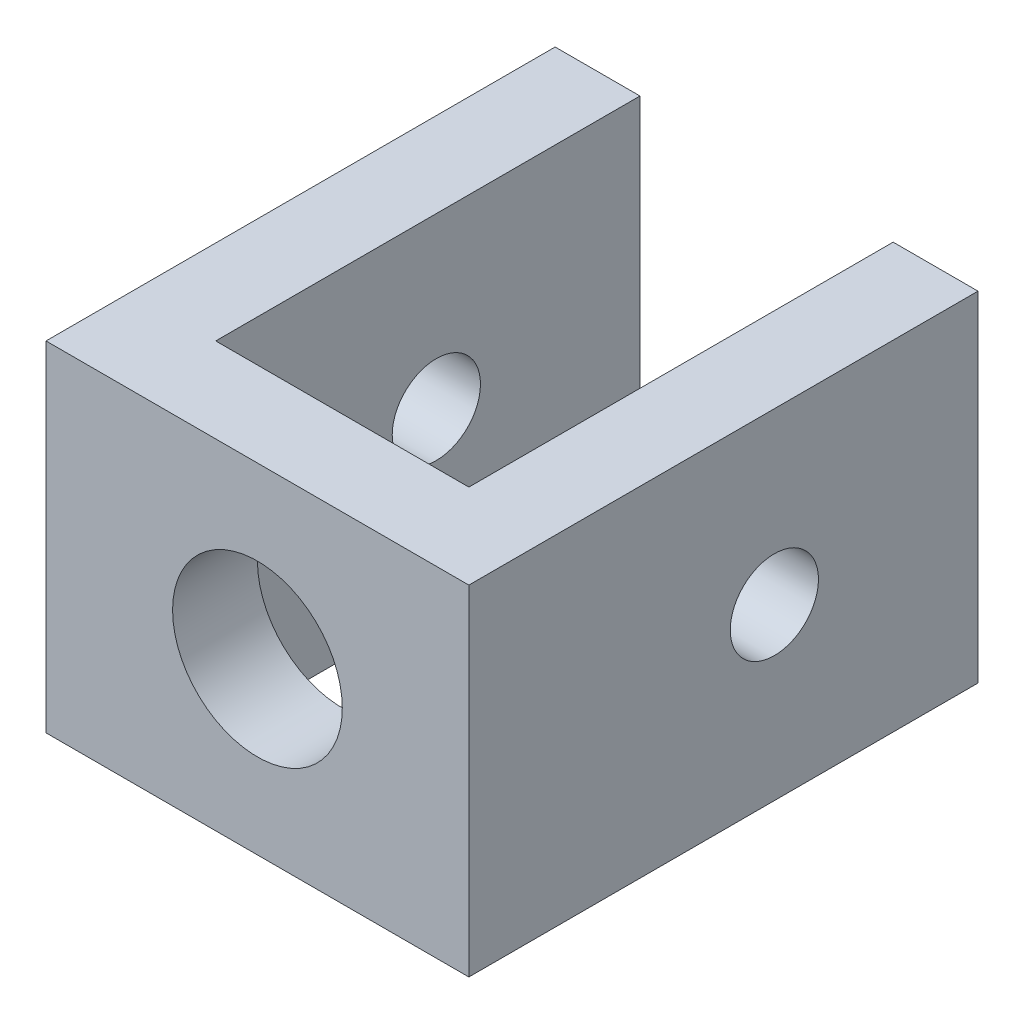
ISO-10303-21;
HEADER;
FILE_DESCRIPTION(('STEP AP214'),'2;1');
FILE_NAME('part.step','',(''),(''),'','','');
FILE_SCHEMA(('AUTOMOTIVE_DESIGN { 1 0 10303 214 1 1 1 1 }'));
ENDSEC;
DATA;
#1=APPLICATION_CONTEXT('core data for automotive mechanical design processes');
#2=APPLICATION_PROTOCOL_DEFINITION('international standard','automotive_design',2000,#1);
#3=PRODUCT_CONTEXT('',#1,'mechanical');
#4=PRODUCT('Part','Part','',(#3));
#5=PRODUCT_RELATED_PRODUCT_CATEGORY('part','',(#4));
#6=PRODUCT_DEFINITION_FORMATION('','',#4);
#7=PRODUCT_DEFINITION_CONTEXT('part definition',#1,'design');
#8=PRODUCT_DEFINITION('design','',#6,#7);
#9=PRODUCT_DEFINITION_SHAPE('','',#8);
#10=(LENGTH_UNIT() NAMED_UNIT(*) SI_UNIT(.MILLI.,.METRE.));
#11=(NAMED_UNIT(*) PLANE_ANGLE_UNIT() SI_UNIT($,.RADIAN.));
#12=(NAMED_UNIT(*) SI_UNIT($,.STERADIAN.) SOLID_ANGLE_UNIT());
#13=UNCERTAINTY_MEASURE_WITH_UNIT(LENGTH_MEASURE(1.E-05),#10,'distance_accuracy_value','');
#14=(GEOMETRIC_REPRESENTATION_CONTEXT(3) GLOBAL_UNCERTAINTY_ASSIGNED_CONTEXT((#13)) GLOBAL_UNIT_ASSIGNED_CONTEXT((#10,
#11,#12)) REPRESENTATION_CONTEXT('',''));
#15=CARTESIAN_POINT('',(0.,0.,0.));
#16=DIRECTION('',(0.,0.,1.));
#17=DIRECTION('',(1.,0.,0.));
#18=AXIS2_PLACEMENT_3D('',#15,#16,#17);
#19=CARTESIAN_POINT('',(31.6444206666666,25.4,0.));
#20=DIRECTION('',(0.,0.,-1.));
#21=DIRECTION('',(-1.,0.,0.));
#22=AXIS2_PLACEMENT_3D('',#19,#20,#21);
#23=PLANE('',#22);
#24=CARTESIAN_POINT('',(15.8222103333333,12.7,0.));
#25=DIRECTION('',(0.,0.,1.));
#26=DIRECTION('',(1.,0.,0.));
#27=AXIS2_PLACEMENT_3D('',#24,#25,#26);
#28=CIRCLE('',#27,6.35);
#29=CARTESIAN_POINT('',(22.1722103333333,12.7,0.));
#30=VERTEX_POINT('',#29);
#31=EDGE_CURVE('E212',#30,#30,#28,.T.);
#32=ORIENTED_EDGE('',*,*,#31,.F.);
#33=EDGE_LOOP('',(#32));
#34=FACE_BOUND('',#33,.T.);
#35=DIRECTION('',(1.,0.,0.));
#36=VECTOR('',#35,1.);
#37=CARTESIAN_POINT('',(31.6444206666666,0.,0.));
#38=LINE('',#37,#36);
#39=CARTESIAN_POINT('',(0.,0.,0.));
#40=VERTEX_POINT('',#39);
#41=CARTESIAN_POINT('',(31.6444206666666,0.,0.));
#42=VERTEX_POINT('',#41);
#43=EDGE_CURVE('E145',#40,#42,#38,.T.);
#44=ORIENTED_EDGE('',*,*,#43,.T.);
#45=DIRECTION('',(0.,-1.,0.));
#46=VECTOR('',#45,1.);
#47=CARTESIAN_POINT('',(31.6444206666666,25.4,0.));
#48=LINE('',#47,#46);
#49=CARTESIAN_POINT('',(31.6444206666666,25.4,0.));
#50=VERTEX_POINT('',#49);
#51=EDGE_CURVE('E11',#50,#42,#48,.T.);
#52=ORIENTED_EDGE('',*,*,#51,.F.);
#53=DIRECTION('',(1.,0.,0.));
#54=VECTOR('',#53,1.);
#55=CARTESIAN_POINT('',(31.6444206666666,25.4,0.));
#56=LINE('',#55,#54);
#57=CARTESIAN_POINT('',(0.,25.4,0.));
#58=VERTEX_POINT('',#57);
#59=EDGE_CURVE('E167',#58,#50,#56,.T.);
#60=ORIENTED_EDGE('',*,*,#59,.F.);
#61=DIRECTION('',(0.,-1.,0.));
#62=VECTOR('',#61,1.);
#63=CARTESIAN_POINT('',(0.,25.4,0.));
#64=LINE('',#63,#62);
#65=EDGE_CURVE('E141',#58,#40,#64,.T.);
#66=ORIENTED_EDGE('',*,*,#65,.T.);
#67=EDGE_LOOP('',(#44,#52,#60,#66));
#68=FACE_BOUND('',#67,.T.);
#69=ADVANCED_FACE('F43',(#34,#68),#23,.F.);
#70=CARTESIAN_POINT('',(31.6444206666666,25.4,0.));
#71=DIRECTION('',(-1.,0.,0.));
#72=DIRECTION('',(0.,0.,1.));
#73=AXIS2_PLACEMENT_3D('',#70,#71,#72);
#74=PLANE('',#73);
#75=CARTESIAN_POINT('',(31.6444206666666,12.7,-22.86));
#76=DIRECTION('',(1.,0.,0.));
#77=DIRECTION('',(0.,0.,-1.));
#78=AXIS2_PLACEMENT_3D('',#75,#76,#77);
#79=CIRCLE('',#78,3.302);
#80=CARTESIAN_POINT('',(31.6444206666666,12.7,-26.162));
#81=VERTEX_POINT('',#80);
#82=EDGE_CURVE('E228',#81,#81,#79,.T.);
#83=ORIENTED_EDGE('',*,*,#82,.F.);
#84=EDGE_LOOP('',(#83));
#85=FACE_BOUND('',#84,.T.);
#86=DIRECTION('',(0.,0.,-1.));
#87=VECTOR('',#86,1.);
#88=CARTESIAN_POINT('',(31.6444206666666,0.,0.));
#89=LINE('',#88,#87);
#90=CARTESIAN_POINT('',(31.6444206666666,0.,-38.1));
#91=VERTEX_POINT('',#90);
#92=EDGE_CURVE('E149',#42,#91,#89,.T.);
#93=ORIENTED_EDGE('',*,*,#92,.T.);
#94=DIRECTION('',(0.,-1.,0.));
#95=VECTOR('',#94,1.);
#96=CARTESIAN_POINT('',(31.6444206666666,25.4,-38.1));
#97=LINE('',#96,#95);
#98=CARTESIAN_POINT('',(31.6444206666666,25.4,-38.1));
#99=VERTEX_POINT('',#98);
#100=EDGE_CURVE('E53',#99,#91,#97,.T.);
#101=ORIENTED_EDGE('',*,*,#100,.F.);
#102=DIRECTION('',(0.,0.,-1.));
#103=VECTOR('',#102,1.);
#104=CARTESIAN_POINT('',(31.6444206666666,25.4,0.));
#105=LINE('',#104,#103);
#106=EDGE_CURVE('E104',#50,#99,#105,.T.);
#107=ORIENTED_EDGE('',*,*,#106,.F.);
#108=ORIENTED_EDGE('',*,*,#51,.T.);
#109=EDGE_LOOP('',(#93,#101,#107,#108));
#110=FACE_BOUND('',#109,.T.);
#111=ADVANCED_FACE('F236',(#85,#110),#74,.F.);
#112=CARTESIAN_POINT('',(31.6444206666666,25.4,-38.1));
#113=DIRECTION('',(0.,0.,1.));
#114=DIRECTION('',(1.,0.,0.));
#115=AXIS2_PLACEMENT_3D('',#112,#113,#114);
#116=PLANE('',#115);
#117=DIRECTION('',(-1.,0.,0.));
#118=VECTOR('',#117,1.);
#119=CARTESIAN_POINT('',(31.6444206666666,0.,-38.1));
#120=LINE('',#119,#118);
#121=CARTESIAN_POINT('',(25.2944206666666,0.,-38.1));
#122=VERTEX_POINT('',#121);
#123=EDGE_CURVE('E152',#91,#122,#120,.T.);
#124=ORIENTED_EDGE('',*,*,#123,.T.);
#125=DIRECTION('',(0.,-1.,0.));
#126=VECTOR('',#125,1.);
#127=CARTESIAN_POINT('',(25.2944206666666,25.4,-38.1));
#128=LINE('',#127,#126);
#129=CARTESIAN_POINT('',(25.2944206666666,25.4,-38.1));
#130=VERTEX_POINT('',#129);
#131=EDGE_CURVE('E178',#130,#122,#128,.T.);
#132=ORIENTED_EDGE('',*,*,#131,.F.);
#133=DIRECTION('',(-1.,0.,0.));
#134=VECTOR('',#133,1.);
#135=CARTESIAN_POINT('',(31.6444206666666,25.4,-38.1));
#136=LINE('',#135,#134);
#137=EDGE_CURVE('E189',#99,#130,#136,.T.);
#138=ORIENTED_EDGE('',*,*,#137,.F.);
#139=ORIENTED_EDGE('',*,*,#100,.T.);
#140=EDGE_LOOP('',(#124,#132,#138,#139));
#141=FACE_BOUND('',#140,.T.);
#142=ADVANCED_FACE('F187',(#141),#116,.F.);
#143=CARTESIAN_POINT('',(25.2944206666666,25.4,-38.1));
#144=DIRECTION('',(1.,0.,0.));
#145=DIRECTION('',(0.,0.,-1.));
#146=AXIS2_PLACEMENT_3D('',#143,#144,#145);
#147=PLANE('',#146);
#148=CARTESIAN_POINT('',(25.2944206666666,12.7,-22.86));
#149=DIRECTION('',(1.,0.,0.));
#150=DIRECTION('',(0.,0.,-1.));
#151=AXIS2_PLACEMENT_3D('',#148,#149,#150);
#152=CIRCLE('',#151,3.302);
#153=CARTESIAN_POINT('',(25.2944206666666,12.7,-26.162));
#154=VERTEX_POINT('',#153);
#155=EDGE_CURVE('E216',#154,#154,#152,.T.);
#156=ORIENTED_EDGE('',*,*,#155,.T.);
#157=EDGE_LOOP('',(#156));
#158=FACE_BOUND('',#157,.T.);
#159=DIRECTION('',(0.,0.,1.));
#160=VECTOR('',#159,1.);
#161=CARTESIAN_POINT('',(25.2944206666666,0.,-38.1));
#162=LINE('',#161,#160);
#163=CARTESIAN_POINT('',(25.2944206666666,0.,-6.35));
#164=VERTEX_POINT('',#163);
#165=EDGE_CURVE('E155',#122,#164,#162,.T.);
#166=ORIENTED_EDGE('',*,*,#165,.T.);
#167=DIRECTION('',(0.,-1.,0.));
#168=VECTOR('',#167,1.);
#169=CARTESIAN_POINT('',(25.2944206666666,25.4,-6.35));
#170=LINE('',#169,#168);
#171=CARTESIAN_POINT('',(25.2944206666666,25.4,-6.35));
#172=VERTEX_POINT('',#171);
#173=EDGE_CURVE('E174',#172,#164,#170,.T.);
#174=ORIENTED_EDGE('',*,*,#173,.F.);
#175=DIRECTION('',(0.,0.,1.));
#176=VECTOR('',#175,1.);
#177=CARTESIAN_POINT('',(25.2944206666666,25.4,-38.1));
#178=LINE('',#177,#176);
#179=EDGE_CURVE('E202',#130,#172,#178,.T.);
#180=ORIENTED_EDGE('',*,*,#179,.F.);
#181=ORIENTED_EDGE('',*,*,#131,.T.);
#182=EDGE_LOOP('',(#166,#174,#180,#181));
#183=FACE_BOUND('',#182,.T.);
#184=ADVANCED_FACE('F197',(#158,#183),#147,.F.);
#185=CARTESIAN_POINT('',(6.35,25.4,-6.35));
#186=DIRECTION('',(0.,0.,1.));
#187=DIRECTION('',(1.,0.,0.));
#188=AXIS2_PLACEMENT_3D('',#185,#186,#187);
#189=PLANE('',#188);
#190=CARTESIAN_POINT('',(15.8222103333333,12.7,-6.34999999999999));
#191=DIRECTION('',(0.,0.,1.));
#192=DIRECTION('',(1.,0.,0.));
#193=AXIS2_PLACEMENT_3D('',#190,#191,#192);
#194=CIRCLE('',#193,6.35);
#195=CARTESIAN_POINT('',(22.1722103333333,12.7,-6.34999999999999));
#196=VERTEX_POINT('',#195);
#197=EDGE_CURVE('E46',#196,#196,#194,.T.);
#198=ORIENTED_EDGE('',*,*,#197,.T.);
#199=EDGE_LOOP('',(#198));
#200=FACE_BOUND('',#199,.T.);
#201=DIRECTION('',(-1.,0.,0.));
#202=VECTOR('',#201,1.);
#203=CARTESIAN_POINT('',(6.35,0.,-6.35));
#204=LINE('',#203,#202);
#205=CARTESIAN_POINT('',(6.35,0.,-6.35));
#206=VERTEX_POINT('',#205);
#207=EDGE_CURVE('E158',#164,#206,#204,.T.);
#208=ORIENTED_EDGE('',*,*,#207,.T.);
#209=DIRECTION('',(0.,-1.,0.));
#210=VECTOR('',#209,1.);
#211=CARTESIAN_POINT('',(6.35,25.4,-6.35));
#212=LINE('',#211,#210);
#213=CARTESIAN_POINT('',(6.35,25.4,-6.35));
#214=VERTEX_POINT('',#213);
#215=EDGE_CURVE('E134',#214,#206,#212,.T.);
#216=ORIENTED_EDGE('',*,*,#215,.F.);
#217=DIRECTION('',(-1.,0.,0.));
#218=VECTOR('',#217,1.);
#219=CARTESIAN_POINT('',(6.35,25.4,-6.35));
#220=LINE('',#219,#218);
#221=EDGE_CURVE('E123',#172,#214,#220,.T.);
#222=ORIENTED_EDGE('',*,*,#221,.F.);
#223=ORIENTED_EDGE('',*,*,#173,.T.);
#224=EDGE_LOOP('',(#208,#216,#222,#223));
#225=FACE_BOUND('',#224,.T.);
#226=ADVANCED_FACE('F200',(#200,#225),#189,.F.);
#227=CARTESIAN_POINT('',(6.35,25.4,-38.1));
#228=DIRECTION('',(-1.,0.,0.));
#229=DIRECTION('',(0.,0.,1.));
#230=AXIS2_PLACEMENT_3D('',#227,#228,#229);
#231=PLANE('',#230);
#232=CARTESIAN_POINT('',(6.35,12.7,-22.86));
#233=DIRECTION('',(-1.,0.,0.));
#234=DIRECTION('',(0.,0.,1.));
#235=AXIS2_PLACEMENT_3D('',#232,#233,#234);
#236=CIRCLE('',#235,3.302);
#237=CARTESIAN_POINT('',(6.35,12.7,-19.558));
#238=VERTEX_POINT('',#237);
#239=EDGE_CURVE('E220',#238,#238,#236,.T.);
#240=ORIENTED_EDGE('',*,*,#239,.T.);
#241=EDGE_LOOP('',(#240));
#242=FACE_BOUND('',#241,.T.);
#243=DIRECTION('',(0.,0.,-1.));
#244=VECTOR('',#243,1.);
#245=CARTESIAN_POINT('',(6.35,0.,-38.1));
#246=LINE('',#245,#244);
#247=CARTESIAN_POINT('',(6.35,0.,-38.1));
#248=VERTEX_POINT('',#247);
#249=EDGE_CURVE('E132',#206,#248,#246,.T.);
#250=ORIENTED_EDGE('',*,*,#249,.T.);
#251=DIRECTION('',(0.,-1.,0.));
#252=VECTOR('',#251,1.);
#253=CARTESIAN_POINT('',(6.35,25.4,-38.1));
#254=LINE('',#253,#252);
#255=CARTESIAN_POINT('',(6.35,25.4,-38.1));
#256=VERTEX_POINT('',#255);
#257=EDGE_CURVE('E129',#256,#248,#254,.T.);
#258=ORIENTED_EDGE('',*,*,#257,.F.);
#259=DIRECTION('',(0.,0.,-1.));
#260=VECTOR('',#259,1.);
#261=CARTESIAN_POINT('',(6.35,25.4,-38.1));
#262=LINE('',#261,#260);
#263=EDGE_CURVE('E117',#214,#256,#262,.T.);
#264=ORIENTED_EDGE('',*,*,#263,.F.);
#265=ORIENTED_EDGE('',*,*,#215,.T.);
#266=EDGE_LOOP('',(#250,#258,#264,#265));
#267=FACE_BOUND('',#266,.T.);
#268=ADVANCED_FACE('F130',(#242,#267),#231,.F.);
#269=CARTESIAN_POINT('',(0.,25.4,-38.1));
#270=DIRECTION('',(0.,0.,1.));
#271=DIRECTION('',(1.,0.,0.));
#272=AXIS2_PLACEMENT_3D('',#269,#270,#271);
#273=PLANE('',#272);
#274=DIRECTION('',(-1.,0.,0.));
#275=VECTOR('',#274,1.);
#276=CARTESIAN_POINT('',(0.,0.,-38.1));
#277=LINE('',#276,#275);
#278=CARTESIAN_POINT('',(0.,0.,-38.1));
#279=VERTEX_POINT('',#278);
#280=EDGE_CURVE('E90',#248,#279,#277,.T.);
#281=ORIENTED_EDGE('',*,*,#280,.T.);
#282=DIRECTION('',(0.,-1.,0.));
#283=VECTOR('',#282,1.);
#284=CARTESIAN_POINT('',(0.,25.4,-38.1));
#285=LINE('',#284,#283);
#286=CARTESIAN_POINT('',(0.,25.4,-38.1));
#287=VERTEX_POINT('',#286);
#288=EDGE_CURVE('E135',#287,#279,#285,.T.);
#289=ORIENTED_EDGE('',*,*,#288,.F.);
#290=DIRECTION('',(-1.,0.,0.));
#291=VECTOR('',#290,1.);
#292=CARTESIAN_POINT('',(0.,25.4,-38.1));
#293=LINE('',#292,#291);
#294=EDGE_CURVE('E121',#256,#287,#293,.T.);
#295=ORIENTED_EDGE('',*,*,#294,.F.);
#296=ORIENTED_EDGE('',*,*,#257,.T.);
#297=EDGE_LOOP('',(#281,#289,#295,#296));
#298=FACE_BOUND('',#297,.T.);
#299=ADVANCED_FACE('F137',(#298),#273,.F.);
#300=CARTESIAN_POINT('',(0.,25.4,0.));
#301=DIRECTION('',(1.,0.,0.));
#302=DIRECTION('',(0.,0.,-1.));
#303=AXIS2_PLACEMENT_3D('',#300,#301,#302);
#304=PLANE('',#303);
#305=CARTESIAN_POINT('',(0.,12.7,-22.86));
#306=DIRECTION('',(1.,0.,0.));
#307=DIRECTION('',(0.,0.,-1.));
#308=AXIS2_PLACEMENT_3D('',#305,#306,#307);
#309=CIRCLE('',#308,3.302);
#310=CARTESIAN_POINT('',(0.,12.7,-26.162));
#311=VERTEX_POINT('',#310);
#312=EDGE_CURVE('E224',#311,#311,#309,.T.);
#313=ORIENTED_EDGE('',*,*,#312,.T.);
#314=EDGE_LOOP('',(#313));
#315=FACE_BOUND('',#314,.T.);
#316=DIRECTION('',(0.,0.,1.));
#317=VECTOR('',#316,1.);
#318=CARTESIAN_POINT('',(0.,0.,0.));
#319=LINE('',#318,#317);
#320=EDGE_CURVE('E96',#279,#40,#319,.T.);
#321=ORIENTED_EDGE('',*,*,#320,.T.);
#322=ORIENTED_EDGE('',*,*,#65,.F.);
#323=DIRECTION('',(0.,0.,1.));
#324=VECTOR('',#323,1.);
#325=CARTESIAN_POINT('',(0.,25.4,0.));
#326=LINE('',#325,#324);
#327=EDGE_CURVE('E61',#287,#58,#326,.T.);
#328=ORIENTED_EDGE('',*,*,#327,.F.);
#329=ORIENTED_EDGE('',*,*,#288,.T.);
#330=EDGE_LOOP('',(#321,#322,#328,#329));
#331=FACE_BOUND('',#330,.T.);
#332=ADVANCED_FACE('F241',(#315,#331),#304,.F.);
#333=CARTESIAN_POINT('',(0.,25.4,0.));
#334=DIRECTION('',(0.,-1.,0.));
#335=DIRECTION('',(0.,0.,-1.));
#336=AXIS2_PLACEMENT_3D('',#333,#334,#335);
#337=PLANE('',#336);
#338=ORIENTED_EDGE('',*,*,#59,.T.);
#339=ORIENTED_EDGE('',*,*,#106,.T.);
#340=ORIENTED_EDGE('',*,*,#137,.T.);
#341=ORIENTED_EDGE('',*,*,#179,.T.);
#342=ORIENTED_EDGE('',*,*,#221,.T.);
#343=ORIENTED_EDGE('',*,*,#263,.T.);
#344=ORIENTED_EDGE('',*,*,#294,.T.);
#345=ORIENTED_EDGE('',*,*,#327,.T.);
#346=EDGE_LOOP('',(#338,#339,#340,#341,#342,#343,#344,#345));
#347=FACE_BOUND('',#346,.T.);
#348=ADVANCED_FACE('F119',(#347),#337,.F.);
#349=CARTESIAN_POINT('',(0.,0.,0.));
#350=DIRECTION('',(0.,-1.,0.));
#351=DIRECTION('',(0.,0.,-1.));
#352=AXIS2_PLACEMENT_3D('',#349,#350,#351);
#353=PLANE('',#352);
#354=ORIENTED_EDGE('',*,*,#43,.F.);
#355=ORIENTED_EDGE('',*,*,#320,.F.);
#356=ORIENTED_EDGE('',*,*,#280,.F.);
#357=ORIENTED_EDGE('',*,*,#249,.F.);
#358=ORIENTED_EDGE('',*,*,#207,.F.);
#359=ORIENTED_EDGE('',*,*,#165,.F.);
#360=ORIENTED_EDGE('',*,*,#123,.F.);
#361=ORIENTED_EDGE('',*,*,#92,.F.);
#362=EDGE_LOOP('',(#354,#355,#356,#357,#358,#359,#360,#361));
#363=FACE_BOUND('',#362,.T.);
#364=ADVANCED_FACE('F193',(#363),#353,.T.);
#365=CARTESIAN_POINT('',(15.8222103333333,12.7,-38.1));
#366=DIRECTION('',(0.,0.,1.));
#367=DIRECTION('',(1.,0.,0.));
#368=AXIS2_PLACEMENT_3D('',#365,#366,#367);
#369=CYLINDRICAL_SURFACE('',#368,6.35);
#370=ORIENTED_EDGE('',*,*,#31,.T.);
#371=EDGE_LOOP('',(#370));
#372=FACE_BOUND('',#371,.T.);
#373=ORIENTED_EDGE('',*,*,#197,.F.);
#374=EDGE_LOOP('',(#373));
#375=FACE_BOUND('',#374,.T.);
#376=ADVANCED_FACE('F258',(#372,#375),#369,.F.);
#377=CARTESIAN_POINT('',(0.,12.7,-22.86));
#378=DIRECTION('',(1.,0.,0.));
#379=DIRECTION('',(0.,0.,-1.));
#380=AXIS2_PLACEMENT_3D('',#377,#378,#379);
#381=CYLINDRICAL_SURFACE('',#380,3.302);
#382=ORIENTED_EDGE('',*,*,#312,.F.);
#383=EDGE_LOOP('',(#382));
#384=FACE_BOUND('',#383,.T.);
#385=ORIENTED_EDGE('',*,*,#239,.F.);
#386=EDGE_LOOP('',(#385));
#387=FACE_BOUND('',#386,.T.);
#388=ADVANCED_FACE('F261',(#384,#387),#381,.F.);
#389=ORIENTED_EDGE('',*,*,#82,.T.);
#390=EDGE_LOOP('',(#389));
#391=FACE_BOUND('',#390,.T.);
#392=ORIENTED_EDGE('',*,*,#155,.F.);
#393=EDGE_LOOP('',(#392));
#394=FACE_BOUND('',#393,.T.);
#395=ADVANCED_FACE('F233',(#391,#394),#381,.F.);
#396=CLOSED_SHELL('',(#69,#111,#142,#184,#226,#268,#299,#332,#348,#364,#376,#388,#395));
#397=MANIFOLD_SOLID_BREP('B2',#396);
#398=ADVANCED_BREP_SHAPE_REPRESENTATION('',(#18,#397),#14);
#399=SHAPE_DEFINITION_REPRESENTATION(#9,#398);
ENDSEC;
END-ISO-10303-21;
